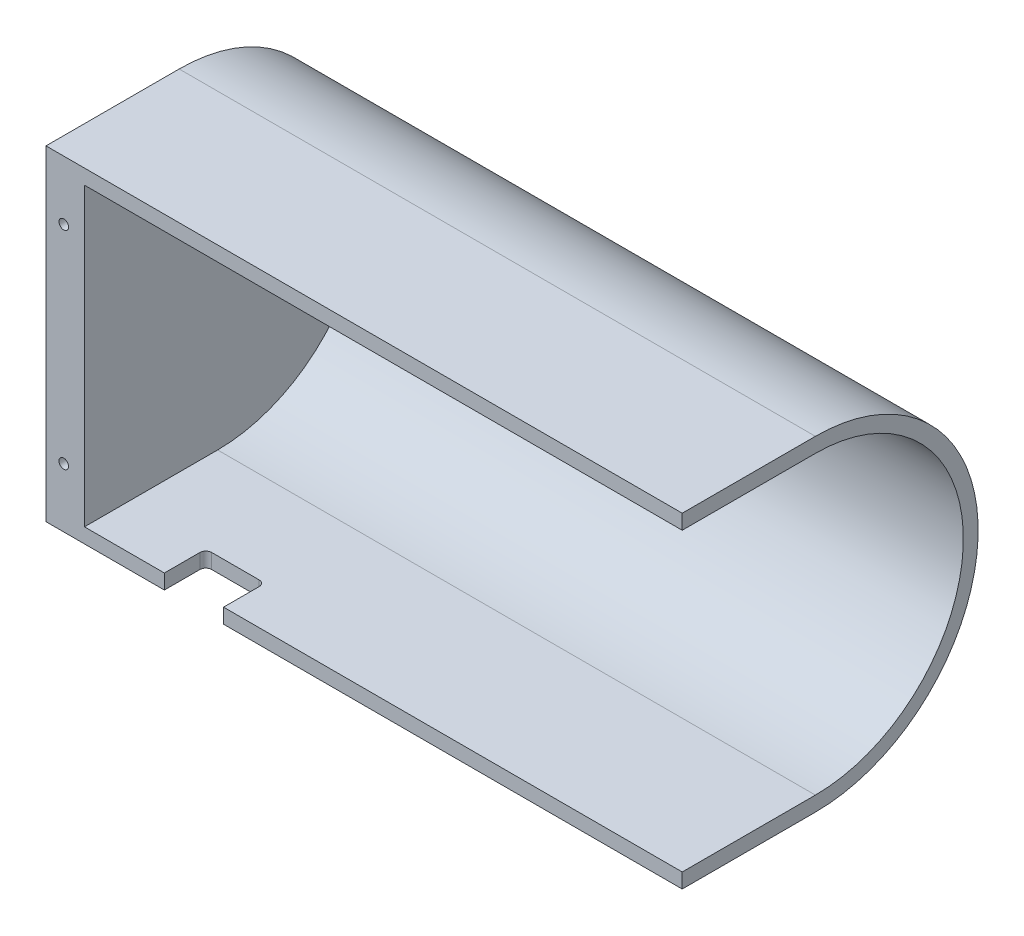
ISO-10303-21;
HEADER;
FILE_DESCRIPTION(('STEP AP214'),'2;1');
FILE_NAME('part.step','',(''),(''),'','','');
FILE_SCHEMA(('AUTOMOTIVE_DESIGN { 1 0 10303 214 1 1 1 1 }'));
ENDSEC;
DATA;
#1=APPLICATION_CONTEXT('core data for automotive mechanical design processes');
#2=APPLICATION_PROTOCOL_DEFINITION('international standard','automotive_design',2000,#1);
#3=PRODUCT_CONTEXT('',#1,'mechanical');
#4=PRODUCT('Part','Part','',(#3));
#5=PRODUCT_RELATED_PRODUCT_CATEGORY('part','',(#4));
#6=PRODUCT_DEFINITION_FORMATION('','',#4);
#7=PRODUCT_DEFINITION_CONTEXT('part definition',#1,'design');
#8=PRODUCT_DEFINITION('design','',#6,#7);
#9=PRODUCT_DEFINITION_SHAPE('','',#8);
#10=(LENGTH_UNIT() NAMED_UNIT(*) SI_UNIT(.MILLI.,.METRE.));
#11=(NAMED_UNIT(*) PLANE_ANGLE_UNIT() SI_UNIT($,.RADIAN.));
#12=(NAMED_UNIT(*) SI_UNIT($,.STERADIAN.) SOLID_ANGLE_UNIT());
#13=UNCERTAINTY_MEASURE_WITH_UNIT(LENGTH_MEASURE(1.E-05),#10,'distance_accuracy_value','');
#14=(GEOMETRIC_REPRESENTATION_CONTEXT(3) GLOBAL_UNCERTAINTY_ASSIGNED_CONTEXT((#13)) GLOBAL_UNIT_ASSIGNED_CONTEXT((#10,
#11,#12)) REPRESENTATION_CONTEXT('',''));
#15=CARTESIAN_POINT('',(0.,0.,0.));
#16=DIRECTION('',(0.,0.,1.));
#17=DIRECTION('',(1.,0.,0.));
#18=AXIS2_PLACEMENT_3D('',#15,#16,#17);
#19=CARTESIAN_POINT('',(0.,0.,-5.));
#20=DIRECTION('',(1.,0.,0.));
#21=DIRECTION('',(0.,1.,0.));
#22=AXIS2_PLACEMENT_3D('',#19,#20,#21);
#23=PLANE('',#22);
#24=DIRECTION('',(0.,0.,1.));
#25=VECTOR('',#24,1.);
#26=CARTESIAN_POINT('',(0.,55.,0.));
#27=LINE('',#26,#25);
#28=CARTESIAN_POINT('',(0.,55.,0.));
#29=VERTEX_POINT('',#28);
#30=CARTESIAN_POINT('',(0.,55.,45.));
#31=VERTEX_POINT('',#30);
#32=EDGE_CURVE('E11',#29,#31,#27,.T.);
#33=ORIENTED_EDGE('',*,*,#32,.F.);
#34=CARTESIAN_POINT('',(0.,0.,0.));
#35=DIRECTION('',(1.,0.,0.));
#36=DIRECTION('',(0.,-1.,0.));
#37=AXIS2_PLACEMENT_3D('',#34,#35,#36);
#38=CIRCLE('',#37,55.);
#39=CARTESIAN_POINT('',(0.,-55.,0.));
#40=VERTEX_POINT('',#39);
#41=EDGE_CURVE('E199',#40,#29,#38,.T.);
#42=ORIENTED_EDGE('',*,*,#41,.F.);
#43=DIRECTION('',(0.,0.,-1.));
#44=VECTOR('',#43,1.);
#45=CARTESIAN_POINT('',(0.,-55.,45.));
#46=LINE('',#45,#44);
#47=CARTESIAN_POINT('',(0.,-55.,45.));
#48=VERTEX_POINT('',#47);
#49=EDGE_CURVE('E234',#48,#40,#46,.T.);
#50=ORIENTED_EDGE('',*,*,#49,.F.);
#51=DIRECTION('',(0.,-1.,0.));
#52=VECTOR('',#51,1.);
#53=CARTESIAN_POINT('',(0.,55.,45.));
#54=LINE('',#53,#52);
#55=EDGE_CURVE('E27',#31,#48,#54,.T.);
#56=ORIENTED_EDGE('',*,*,#55,.F.);
#57=EDGE_LOOP('',(#33,#42,#50,#56));
#58=FACE_BOUND('',#57,.T.);
#59=ADVANCED_FACE('F16',(#58),#23,.F.);
#60=CARTESIAN_POINT('',(0.,55.,0.));
#61=DIRECTION('',(0.,1.,0.));
#62=DIRECTION('',(0.,0.,-1.));
#63=AXIS2_PLACEMENT_3D('',#60,#61,#62);
#64=PLANE('',#63);
#65=ORIENTED_EDGE('',*,*,#32,.T.);
#66=DIRECTION('',(1.,0.,0.));
#67=VECTOR('',#66,1.);
#68=CARTESIAN_POINT('',(0.,55.,45.));
#69=LINE('',#68,#67);
#70=CARTESIAN_POINT('',(215.,55.,45.));
#71=VERTEX_POINT('',#70);
#72=EDGE_CURVE('E231',#31,#71,#69,.T.);
#73=ORIENTED_EDGE('',*,*,#72,.T.);
#74=DIRECTION('',(0.,0.,1.));
#75=VECTOR('',#74,1.);
#76=CARTESIAN_POINT('',(215.,55.,0.));
#77=LINE('',#76,#75);
#78=CARTESIAN_POINT('',(215.,55.,0.));
#79=VERTEX_POINT('',#78);
#80=EDGE_CURVE('E200',#79,#71,#77,.T.);
#81=ORIENTED_EDGE('',*,*,#80,.F.);
#82=DIRECTION('',(1.,0.,0.));
#83=VECTOR('',#82,1.);
#84=CARTESIAN_POINT('',(0.,55.,0.));
#85=LINE('',#84,#83);
#86=EDGE_CURVE('E255',#29,#79,#85,.T.);
#87=ORIENTED_EDGE('',*,*,#86,.F.);
#88=EDGE_LOOP('',(#65,#73,#81,#87));
#89=FACE_BOUND('',#88,.T.);
#90=ADVANCED_FACE('F332',(#89),#64,.T.);
#91=CARTESIAN_POINT('',(0.,55.,45.));
#92=DIRECTION('',(0.,0.,1.));
#93=DIRECTION('',(1.,0.,0.));
#94=AXIS2_PLACEMENT_3D('',#91,#92,#93);
#95=PLANE('',#94);
#96=CARTESIAN_POINT('',(6.,-35.,45.));
#97=DIRECTION('',(0.,0.,-1.));
#98=DIRECTION('',(1.,0.,0.));
#99=AXIS2_PLACEMENT_3D('',#96,#97,#98);
#100=CIRCLE('',#99,1.621);
#101=CARTESIAN_POINT('',(4.379,-35.,45.));
#102=VERTEX_POINT('',#101);
#103=EDGE_CURVE('E286',#102,#102,#100,.T.);
#104=ORIENTED_EDGE('',*,*,#103,.T.);
#105=EDGE_LOOP('',(#104));
#106=FACE_BOUND('',#105,.T.);
#107=CARTESIAN_POINT('',(6.,35.,45.));
#108=DIRECTION('',(0.,0.,-1.));
#109=DIRECTION('',(1.,0.,0.));
#110=AXIS2_PLACEMENT_3D('',#107,#108,#109);
#111=CIRCLE('',#110,1.621);
#112=CARTESIAN_POINT('',(4.379,35.,45.));
#113=VERTEX_POINT('',#112);
#114=EDGE_CURVE('E264',#113,#113,#111,.T.);
#115=ORIENTED_EDGE('',*,*,#114,.T.);
#116=EDGE_LOOP('',(#115));
#117=FACE_BOUND('',#116,.T.);
#118=DIRECTION('',(0.,1.,0.));
#119=VECTOR('',#118,1.);
#120=CARTESIAN_POINT('',(40.,0.,45.));
#121=LINE('',#120,#119);
#122=CARTESIAN_POINT('',(40.,-55.,45.));
#123=VERTEX_POINT('',#122);
#124=CARTESIAN_POINT('',(40.,-50.,45.));
#125=VERTEX_POINT('',#124);
#126=EDGE_CURVE('E239',#123,#125,#121,.T.);
#127=ORIENTED_EDGE('',*,*,#126,.T.);
#128=DIRECTION('',(1.,0.,0.));
#129=VECTOR('',#128,1.);
#130=CARTESIAN_POINT('',(13.,-50.,45.));
#131=LINE('',#130,#129);
#132=CARTESIAN_POINT('',(13.,-50.,45.));
#133=VERTEX_POINT('',#132);
#134=EDGE_CURVE('E193',#133,#125,#131,.T.);
#135=ORIENTED_EDGE('',*,*,#134,.F.);
#136=DIRECTION('',(0.,-1.,0.));
#137=VECTOR('',#136,1.);
#138=CARTESIAN_POINT('',(13.,55.,45.));
#139=LINE('',#138,#137);
#140=CARTESIAN_POINT('',(13.,50.,45.));
#141=VERTEX_POINT('',#140);
#142=EDGE_CURVE('E187',#141,#133,#139,.T.);
#143=ORIENTED_EDGE('',*,*,#142,.F.);
#144=DIRECTION('',(1.,0.,0.));
#145=VECTOR('',#144,1.);
#146=CARTESIAN_POINT('',(13.,50.,45.));
#147=LINE('',#146,#145);
#148=CARTESIAN_POINT('',(215.,50.,45.));
#149=VERTEX_POINT('',#148);
#150=EDGE_CURVE('E192',#141,#149,#147,.T.);
#151=ORIENTED_EDGE('',*,*,#150,.T.);
#152=DIRECTION('',(0.,-1.,0.));
#153=VECTOR('',#152,1.);
#154=CARTESIAN_POINT('',(215.,55.,45.));
#155=LINE('',#154,#153);
#156=EDGE_CURVE('E207',#71,#149,#155,.T.);
#157=ORIENTED_EDGE('',*,*,#156,.F.);
#158=ORIENTED_EDGE('',*,*,#72,.F.);
#159=ORIENTED_EDGE('',*,*,#55,.T.);
#160=DIRECTION('',(1.,0.,0.));
#161=VECTOR('',#160,1.);
#162=CARTESIAN_POINT('',(0.,-55.,45.));
#163=LINE('',#162,#161);
#164=EDGE_CURVE('E270',#48,#123,#163,.T.);
#165=ORIENTED_EDGE('',*,*,#164,.T.);
#166=EDGE_LOOP('',(#127,#135,#143,#151,#157,#158,#159,#165));
#167=FACE_BOUND('',#166,.T.);
#168=ADVANCED_FACE('F190',(#106,#117,#167),#95,.T.);
#169=CARTESIAN_POINT('',(0.,-55.,45.));
#170=DIRECTION('',(0.,-1.,0.));
#171=DIRECTION('',(0.,0.,-1.));
#172=AXIS2_PLACEMENT_3D('',#169,#170,#171);
#173=PLANE('',#172);
#174=DIRECTION('',(0.,0.,1.));
#175=VECTOR('',#174,1.);
#176=CARTESIAN_POINT('',(40.,-55.,39.));
#177=LINE('',#176,#175);
#178=CARTESIAN_POINT('',(40.,-55.,33.));
#179=VERTEX_POINT('',#178);
#180=EDGE_CURVE('E243',#179,#123,#177,.T.);
#181=ORIENTED_EDGE('',*,*,#180,.T.);
#182=ORIENTED_EDGE('',*,*,#164,.F.);
#183=ORIENTED_EDGE('',*,*,#49,.T.);
#184=DIRECTION('',(1.,0.,0.));
#185=VECTOR('',#184,1.);
#186=CARTESIAN_POINT('',(0.,-55.,0.));
#187=LINE('',#186,#185);
#188=CARTESIAN_POINT('',(215.,-55.,0.));
#189=VERTEX_POINT('',#188);
#190=EDGE_CURVE('E273',#40,#189,#187,.T.);
#191=ORIENTED_EDGE('',*,*,#190,.T.);
#192=DIRECTION('',(0.,0.,-1.));
#193=VECTOR('',#192,1.);
#194=CARTESIAN_POINT('',(215.,-55.,45.));
#195=LINE('',#194,#193);
#196=CARTESIAN_POINT('',(215.,-55.,45.));
#197=VERTEX_POINT('',#196);
#198=EDGE_CURVE('E227',#197,#189,#195,.T.);
#199=ORIENTED_EDGE('',*,*,#198,.F.);
#200=DIRECTION('',(1.,0.,0.));
#201=VECTOR('',#200,1.);
#202=CARTESIAN_POINT('',(0.,-55.,45.));
#203=LINE('',#202,#201);
#204=CARTESIAN_POINT('',(60.,-55.,45.));
#205=VERTEX_POINT('',#204);
#206=EDGE_CURVE('E263',#205,#197,#203,.T.);
#207=ORIENTED_EDGE('',*,*,#206,.F.);
#208=DIRECTION('',(0.,0.,-1.));
#209=VECTOR('',#208,1.);
#210=CARTESIAN_POINT('',(60.,-55.,45.));
#211=LINE('',#210,#209);
#212=CARTESIAN_POINT('',(60.,-55.,33.));
#213=VERTEX_POINT('',#212);
#214=EDGE_CURVE('E225',#205,#213,#211,.T.);
#215=ORIENTED_EDGE('',*,*,#214,.T.);
#216=CARTESIAN_POINT('',(58.,-55.,33.));
#217=DIRECTION('',(0.,1.,0.));
#218=DIRECTION('',(0.,0.,-1.));
#219=AXIS2_PLACEMENT_3D('',#216,#217,#218);
#220=CIRCLE('',#219,2.);
#221=CARTESIAN_POINT('',(58.,-55.,31.));
#222=VERTEX_POINT('',#221);
#223=EDGE_CURVE('E163',#213,#222,#220,.T.);
#224=ORIENTED_EDGE('',*,*,#223,.T.);
#225=DIRECTION('',(-1.,0.,0.));
#226=VECTOR('',#225,1.);
#227=CARTESIAN_POINT('',(29.,-55.,31.));
#228=LINE('',#227,#226);
#229=CARTESIAN_POINT('',(42.,-55.,31.));
#230=VERTEX_POINT('',#229);
#231=EDGE_CURVE('E306',#222,#230,#228,.T.);
#232=ORIENTED_EDGE('',*,*,#231,.T.);
#233=CARTESIAN_POINT('',(42.,-55.,33.));
#234=DIRECTION('',(0.,1.,0.));
#235=DIRECTION('',(-1.,0.,0.));
#236=AXIS2_PLACEMENT_3D('',#233,#234,#235);
#237=CIRCLE('',#236,2.);
#238=EDGE_CURVE('E279',#230,#179,#237,.T.);
#239=ORIENTED_EDGE('',*,*,#238,.T.);
#240=EDGE_LOOP('',(#181,#182,#183,#191,#199,#207,#215,#224,#232,#239));
#241=FACE_BOUND('',#240,.T.);
#242=ADVANCED_FACE('F371',(#241),#173,.T.);
#243=CARTESIAN_POINT('',(0.,0.,0.));
#244=DIRECTION('',(1.,0.,0.));
#245=DIRECTION('',(0.,-1.,0.));
#246=AXIS2_PLACEMENT_3D('',#243,#244,#245);
#247=CYLINDRICAL_SURFACE('',#246,55.);
#248=ORIENTED_EDGE('',*,*,#41,.T.);
#249=ORIENTED_EDGE('',*,*,#86,.T.);
#250=CARTESIAN_POINT('',(215.,0.,0.));
#251=DIRECTION('',(1.,0.,0.));
#252=DIRECTION('',(0.,-1.,0.));
#253=AXIS2_PLACEMENT_3D('',#250,#251,#252);
#254=CIRCLE('',#253,55.);
#255=EDGE_CURVE('E230',#189,#79,#254,.T.);
#256=ORIENTED_EDGE('',*,*,#255,.F.);
#257=ORIENTED_EDGE('',*,*,#190,.F.);
#258=EDGE_LOOP('',(#248,#249,#256,#257));
#259=FACE_BOUND('',#258,.T.);
#260=ADVANCED_FACE('F386',(#259),#247,.T.);
#261=CARTESIAN_POINT('',(13.,0.,-5.));
#262=DIRECTION('',(1.,0.,0.));
#263=DIRECTION('',(0.,1.,0.));
#264=AXIS2_PLACEMENT_3D('',#261,#262,#263);
#265=PLANE('',#264);
#266=DIRECTION('',(0.,0.,-1.));
#267=VECTOR('',#266,1.);
#268=CARTESIAN_POINT('',(13.,-50.,-2.5));
#269=LINE('',#268,#267);
#270=CARTESIAN_POINT('',(13.,-50.,0.));
#271=VERTEX_POINT('',#270);
#272=EDGE_CURVE('E244',#133,#271,#269,.T.);
#273=ORIENTED_EDGE('',*,*,#272,.T.);
#274=CARTESIAN_POINT('',(13.,0.,0.));
#275=DIRECTION('',(1.,0.,0.));
#276=DIRECTION('',(0.,1.,0.));
#277=AXIS2_PLACEMENT_3D('',#274,#275,#276);
#278=CIRCLE('',#277,50.);
#279=CARTESIAN_POINT('',(13.,50.,0.));
#280=VERTEX_POINT('',#279);
#281=EDGE_CURVE('E211',#271,#280,#278,.T.);
#282=ORIENTED_EDGE('',*,*,#281,.T.);
#283=DIRECTION('',(0.,0.,1.));
#284=VECTOR('',#283,1.);
#285=CARTESIAN_POINT('',(13.,50.,20.));
#286=LINE('',#285,#284);
#287=EDGE_CURVE('E204',#280,#141,#286,.T.);
#288=ORIENTED_EDGE('',*,*,#287,.T.);
#289=ORIENTED_EDGE('',*,*,#142,.T.);
#290=EDGE_LOOP('',(#273,#282,#288,#289));
#291=FACE_BOUND('',#290,.T.);
#292=ADVANCED_FACE('F210',(#291),#265,.T.);
#293=CARTESIAN_POINT('',(215.,0.,-5.));
#294=DIRECTION('',(1.,0.,0.));
#295=DIRECTION('',(0.,1.,0.));
#296=AXIS2_PLACEMENT_3D('',#293,#294,#295);
#297=PLANE('',#296);
#298=ORIENTED_EDGE('',*,*,#156,.T.);
#299=DIRECTION('',(0.,0.,-1.));
#300=VECTOR('',#299,1.);
#301=CARTESIAN_POINT('',(215.,50.,45.));
#302=LINE('',#301,#300);
#303=CARTESIAN_POINT('',(215.,50.,0.));
#304=VERTEX_POINT('',#303);
#305=EDGE_CURVE('E179',#149,#304,#302,.T.);
#306=ORIENTED_EDGE('',*,*,#305,.T.);
#307=CARTESIAN_POINT('',(215.,0.,0.));
#308=DIRECTION('',(-1.,0.,0.));
#309=DIRECTION('',(0.,1.,0.));
#310=AXIS2_PLACEMENT_3D('',#307,#308,#309);
#311=CIRCLE('',#310,50.);
#312=CARTESIAN_POINT('',(215.,-50.,0.));
#313=VERTEX_POINT('',#312);
#314=EDGE_CURVE('E221',#304,#313,#311,.T.);
#315=ORIENTED_EDGE('',*,*,#314,.T.);
#316=DIRECTION('',(0.,0.,1.));
#317=VECTOR('',#316,1.);
#318=CARTESIAN_POINT('',(215.,-50.,0.));
#319=LINE('',#318,#317);
#320=CARTESIAN_POINT('',(215.,-50.,45.));
#321=VERTEX_POINT('',#320);
#322=EDGE_CURVE('E278',#313,#321,#319,.T.);
#323=ORIENTED_EDGE('',*,*,#322,.T.);
#324=DIRECTION('',(0.,-1.,0.));
#325=VECTOR('',#324,1.);
#326=CARTESIAN_POINT('',(215.,55.,45.));
#327=LINE('',#326,#325);
#328=EDGE_CURVE('E299',#321,#197,#327,.T.);
#329=ORIENTED_EDGE('',*,*,#328,.T.);
#330=ORIENTED_EDGE('',*,*,#198,.T.);
#331=ORIENTED_EDGE('',*,*,#255,.T.);
#332=ORIENTED_EDGE('',*,*,#80,.T.);
#333=EDGE_LOOP('',(#298,#306,#315,#323,#329,#330,#331,#332));
#334=FACE_BOUND('',#333,.T.);
#335=ADVANCED_FACE('F326',(#334),#297,.T.);
#336=CARTESIAN_POINT('',(13.,50.,45.));
#337=DIRECTION('',(0.,-1.,0.));
#338=DIRECTION('',(0.,0.,-1.));
#339=AXIS2_PLACEMENT_3D('',#336,#337,#338);
#340=PLANE('',#339);
#341=ORIENTED_EDGE('',*,*,#287,.F.);
#342=DIRECTION('',(1.,0.,0.));
#343=VECTOR('',#342,1.);
#344=CARTESIAN_POINT('',(13.,50.,0.));
#345=LINE('',#344,#343);
#346=EDGE_CURVE('E213',#280,#304,#345,.T.);
#347=ORIENTED_EDGE('',*,*,#346,.T.);
#348=ORIENTED_EDGE('',*,*,#305,.F.);
#349=ORIENTED_EDGE('',*,*,#150,.F.);
#350=EDGE_LOOP('',(#341,#347,#348,#349));
#351=FACE_BOUND('',#350,.T.);
#352=ADVANCED_FACE('F203',(#351),#340,.T.);
#353=CARTESIAN_POINT('',(13.,0.,0.));
#354=DIRECTION('',(1.,0.,0.));
#355=DIRECTION('',(0.,1.,0.));
#356=AXIS2_PLACEMENT_3D('',#353,#354,#355);
#357=CYLINDRICAL_SURFACE('',#356,50.);
#358=ORIENTED_EDGE('',*,*,#281,.F.);
#359=DIRECTION('',(1.,0.,0.));
#360=VECTOR('',#359,1.);
#361=CARTESIAN_POINT('',(13.,-50.,0.));
#362=LINE('',#361,#360);
#363=EDGE_CURVE('E20',#271,#313,#362,.T.);
#364=ORIENTED_EDGE('',*,*,#363,.T.);
#365=ORIENTED_EDGE('',*,*,#314,.F.);
#366=ORIENTED_EDGE('',*,*,#346,.F.);
#367=EDGE_LOOP('',(#358,#364,#365,#366));
#368=FACE_BOUND('',#367,.T.);
#369=ADVANCED_FACE('F413',(#368),#357,.F.);
#370=CARTESIAN_POINT('',(6.,-35.,40.));
#371=DIRECTION('',(0.,0.,1.));
#372=DIRECTION('',(1.,0.,0.));
#373=AXIS2_PLACEMENT_3D('',#370,#371,#372);
#374=CYLINDRICAL_SURFACE('',#373,1.621);
#375=ORIENTED_EDGE('',*,*,#103,.F.);
#376=DIRECTION('',(0.,0.,-1.));
#377=VECTOR('',#376,1.);
#378=CARTESIAN_POINT('',(4.379,-35.,40.));
#379=LINE('',#378,#377);
#380=CARTESIAN_POINT('',(4.379,-35.,35.));
#381=VERTEX_POINT('',#380);
#382=EDGE_CURVE('E283',#102,#381,#379,.T.);
#383=ORIENTED_EDGE('',*,*,#382,.T.);
#384=CARTESIAN_POINT('',(6.,-35.,35.));
#385=DIRECTION('',(0.,0.,1.));
#386=DIRECTION('',(1.,0.,0.));
#387=AXIS2_PLACEMENT_3D('',#384,#385,#386);
#388=CIRCLE('',#387,1.621);
#389=EDGE_CURVE('E294',#381,#381,#388,.T.);
#390=ORIENTED_EDGE('',*,*,#389,.F.);
#391=ORIENTED_EDGE('',*,*,#382,.F.);
#392=EDGE_LOOP('',(#375,#383,#390,#391));
#393=FACE_BOUND('',#392,.T.);
#394=ADVANCED_FACE('F397',(#393),#374,.F.);
#395=CARTESIAN_POINT('',(6.,-35.,34.5130024682782));
#396=DIRECTION('',(0.,0.,1.));
#397=DIRECTION('',(1.,0.,0.));
#398=AXIS2_PLACEMENT_3D('',#395,#396,#397);
#399=CONICAL_SURFACE('',#398,0.8105,1.02974425867665);
#400=ORIENTED_EDGE('',*,*,#389,.T.);
#401=DIRECTION('',(0.857167300702112,0.,-0.515038074910054));
#402=VECTOR('',#401,1.);
#403=CARTESIAN_POINT('',(5.1895,-35.,34.5130024682782));
#404=LINE('',#403,#402);
#405=CARTESIAN_POINT('',(6.,-35.,34.0260049365563));
#406=VERTEX_POINT('',#405);
#407=EDGE_CURVE('E298',#381,#406,#404,.T.);
#408=ORIENTED_EDGE('',*,*,#407,.T.);
#409=ORIENTED_EDGE('',*,*,#407,.F.);
#410=EDGE_LOOP('',(#400,#408,#409));
#411=FACE_BOUND('',#410,.T.);
#412=ADVANCED_FACE('F401',(#411),#399,.F.);
#413=CARTESIAN_POINT('',(6.,35.,40.));
#414=DIRECTION('',(0.,0.,1.));
#415=DIRECTION('',(1.,0.,0.));
#416=AXIS2_PLACEMENT_3D('',#413,#414,#415);
#417=CYLINDRICAL_SURFACE('',#416,1.621);
#418=ORIENTED_EDGE('',*,*,#114,.F.);
#419=DIRECTION('',(0.,0.,-1.));
#420=VECTOR('',#419,1.);
#421=CARTESIAN_POINT('',(4.379,35.,40.));
#422=LINE('',#421,#420);
#423=CARTESIAN_POINT('',(4.379,35.,35.));
#424=VERTEX_POINT('',#423);
#425=EDGE_CURVE('E268',#113,#424,#422,.T.);
#426=ORIENTED_EDGE('',*,*,#425,.T.);
#427=CARTESIAN_POINT('',(6.,35.,35.));
#428=DIRECTION('',(0.,0.,1.));
#429=DIRECTION('',(1.,0.,0.));
#430=AXIS2_PLACEMENT_3D('',#427,#428,#429);
#431=CIRCLE('',#430,1.621);
#432=EDGE_CURVE('E293',#424,#424,#431,.T.);
#433=ORIENTED_EDGE('',*,*,#432,.F.);
#434=ORIENTED_EDGE('',*,*,#425,.F.);
#435=EDGE_LOOP('',(#418,#426,#433,#434));
#436=FACE_BOUND('',#435,.T.);
#437=ADVANCED_FACE('F403',(#436),#417,.F.);
#438=CARTESIAN_POINT('',(6.,35.,34.5130024682782));
#439=DIRECTION('',(0.,0.,1.));
#440=DIRECTION('',(1.,0.,0.));
#441=AXIS2_PLACEMENT_3D('',#438,#439,#440);
#442=CONICAL_SURFACE('',#441,0.8105,1.02974425867665);
#443=ORIENTED_EDGE('',*,*,#432,.T.);
#444=DIRECTION('',(0.857167300702112,0.,-0.515038074910054));
#445=VECTOR('',#444,1.);
#446=CARTESIAN_POINT('',(5.1895,35.,34.5130024682782));
#447=LINE('',#446,#445);
#448=CARTESIAN_POINT('',(6.,35.,34.0260049365563));
#449=VERTEX_POINT('',#448);
#450=EDGE_CURVE('E269',#424,#449,#447,.T.);
#451=ORIENTED_EDGE('',*,*,#450,.T.);
#452=ORIENTED_EDGE('',*,*,#450,.F.);
#453=EDGE_LOOP('',(#443,#451,#452));
#454=FACE_BOUND('',#453,.T.);
#455=ADVANCED_FACE('F410',(#454),#442,.F.);
#456=CARTESIAN_POINT('',(0.,55.,45.));
#457=DIRECTION('',(0.,0.,1.));
#458=DIRECTION('',(1.,0.,0.));
#459=AXIS2_PLACEMENT_3D('',#456,#457,#458);
#460=PLANE('',#459);
#461=DIRECTION('',(0.,-1.,0.));
#462=VECTOR('',#461,1.);
#463=CARTESIAN_POINT('',(60.,0.,45.));
#464=LINE('',#463,#462);
#465=CARTESIAN_POINT('',(60.,-50.,45.));
#466=VERTEX_POINT('',#465);
#467=EDGE_CURVE('E240',#466,#205,#464,.T.);
#468=ORIENTED_EDGE('',*,*,#467,.T.);
#469=ORIENTED_EDGE('',*,*,#206,.T.);
#470=ORIENTED_EDGE('',*,*,#328,.F.);
#471=DIRECTION('',(1.,0.,0.));
#472=VECTOR('',#471,1.);
#473=CARTESIAN_POINT('',(13.,-50.,45.));
#474=LINE('',#473,#472);
#475=EDGE_CURVE('E274',#466,#321,#474,.T.);
#476=ORIENTED_EDGE('',*,*,#475,.F.);
#477=EDGE_LOOP('',(#468,#469,#470,#476));
#478=FACE_BOUND('',#477,.T.);
#479=ADVANCED_FACE('F436',(#478),#460,.T.);
#480=CARTESIAN_POINT('',(13.,-50.,0.));
#481=DIRECTION('',(0.,1.,0.));
#482=DIRECTION('',(0.,0.,-1.));
#483=AXIS2_PLACEMENT_3D('',#480,#481,#482);
#484=PLANE('',#483);
#485=DIRECTION('',(0.,0.,-1.));
#486=VECTOR('',#485,1.);
#487=CARTESIAN_POINT('',(40.,-50.,16.5));
#488=LINE('',#487,#486);
#489=CARTESIAN_POINT('',(40.,-50.,33.));
#490=VERTEX_POINT('',#489);
#491=EDGE_CURVE('E235',#125,#490,#488,.T.);
#492=ORIENTED_EDGE('',*,*,#491,.T.);
#493=CARTESIAN_POINT('',(42.,-50.,33.));
#494=DIRECTION('',(0.,-1.,0.));
#495=DIRECTION('',(-1.,0.,0.));
#496=AXIS2_PLACEMENT_3D('',#493,#494,#495);
#497=CIRCLE('',#496,2.);
#498=CARTESIAN_POINT('',(42.,-50.,31.));
#499=VERTEX_POINT('',#498);
#500=EDGE_CURVE('E282',#490,#499,#497,.T.);
#501=ORIENTED_EDGE('',*,*,#500,.T.);
#502=DIRECTION('',(1.,0.,0.));
#503=VECTOR('',#502,1.);
#504=CARTESIAN_POINT('',(35.5,-50.,31.));
#505=LINE('',#504,#503);
#506=CARTESIAN_POINT('',(58.,-50.,31.));
#507=VERTEX_POINT('',#506);
#508=EDGE_CURVE('E247',#499,#507,#505,.T.);
#509=ORIENTED_EDGE('',*,*,#508,.T.);
#510=CARTESIAN_POINT('',(58.,-50.,33.));
#511=DIRECTION('',(0.,-1.,0.));
#512=DIRECTION('',(0.,0.,-1.));
#513=AXIS2_PLACEMENT_3D('',#510,#511,#512);
#514=CIRCLE('',#513,2.);
#515=CARTESIAN_POINT('',(60.,-50.,33.));
#516=VERTEX_POINT('',#515);
#517=EDGE_CURVE('E355',#507,#516,#514,.T.);
#518=ORIENTED_EDGE('',*,*,#517,.T.);
#519=DIRECTION('',(0.,0.,1.));
#520=VECTOR('',#519,1.);
#521=CARTESIAN_POINT('',(60.,-50.,22.5));
#522=LINE('',#521,#520);
#523=EDGE_CURVE('E152',#516,#466,#522,.T.);
#524=ORIENTED_EDGE('',*,*,#523,.T.);
#525=ORIENTED_EDGE('',*,*,#475,.T.);
#526=ORIENTED_EDGE('',*,*,#322,.F.);
#527=ORIENTED_EDGE('',*,*,#363,.F.);
#528=ORIENTED_EDGE('',*,*,#272,.F.);
#529=ORIENTED_EDGE('',*,*,#134,.T.);
#530=EDGE_LOOP('',(#492,#501,#509,#518,#524,#525,#526,#527,#528,#529));
#531=FACE_BOUND('',#530,.T.);
#532=ADVANCED_FACE('F443',(#531),#484,.T.);
#533=CARTESIAN_POINT('',(42.,-55.,33.));
#534=DIRECTION('',(0.,1.,0.));
#535=DIRECTION('',(-1.,0.,0.));
#536=AXIS2_PLACEMENT_3D('',#533,#534,#535);
#537=CYLINDRICAL_SURFACE('',#536,2.);
#538=ORIENTED_EDGE('',*,*,#500,.F.);
#539=DIRECTION('',(0.,1.,0.));
#540=VECTOR('',#539,1.);
#541=CARTESIAN_POINT('',(40.,-55.,33.));
#542=LINE('',#541,#540);
#543=EDGE_CURVE('E313',#179,#490,#542,.T.);
#544=ORIENTED_EDGE('',*,*,#543,.F.);
#545=ORIENTED_EDGE('',*,*,#238,.F.);
#546=DIRECTION('',(0.,1.,0.));
#547=VECTOR('',#546,1.);
#548=CARTESIAN_POINT('',(42.,-55.,31.));
#549=LINE('',#548,#547);
#550=EDGE_CURVE('E250',#230,#499,#549,.T.);
#551=ORIENTED_EDGE('',*,*,#550,.T.);
#552=EDGE_LOOP('',(#538,#544,#545,#551));
#553=FACE_BOUND('',#552,.T.);
#554=ADVANCED_FACE('F18',(#553),#537,.F.);
#555=CARTESIAN_POINT('',(40.,-55.,33.));
#556=DIRECTION('',(-1.,0.,0.));
#557=DIRECTION('',(0.,0.,1.));
#558=AXIS2_PLACEMENT_3D('',#555,#556,#557);
#559=PLANE('',#558);
#560=ORIENTED_EDGE('',*,*,#491,.F.);
#561=ORIENTED_EDGE('',*,*,#126,.F.);
#562=ORIENTED_EDGE('',*,*,#180,.F.);
#563=ORIENTED_EDGE('',*,*,#543,.T.);
#564=EDGE_LOOP('',(#560,#561,#562,#563));
#565=FACE_BOUND('',#564,.T.);
#566=ADVANCED_FACE('F381',(#565),#559,.F.);
#567=CARTESIAN_POINT('',(60.,-55.,45.));
#568=DIRECTION('',(1.,0.,0.));
#569=DIRECTION('',(0.,0.,1.));
#570=AXIS2_PLACEMENT_3D('',#567,#568,#569);
#571=PLANE('',#570);
#572=ORIENTED_EDGE('',*,*,#523,.F.);
#573=DIRECTION('',(0.,1.,0.));
#574=VECTOR('',#573,1.);
#575=CARTESIAN_POINT('',(60.,-55.,33.));
#576=LINE('',#575,#574);
#577=EDGE_CURVE('E260',#213,#516,#576,.T.);
#578=ORIENTED_EDGE('',*,*,#577,.F.);
#579=ORIENTED_EDGE('',*,*,#214,.F.);
#580=ORIENTED_EDGE('',*,*,#467,.F.);
#581=EDGE_LOOP('',(#572,#578,#579,#580));
#582=FACE_BOUND('',#581,.T.);
#583=ADVANCED_FACE('F457',(#582),#571,.F.);
#584=CARTESIAN_POINT('',(58.,-55.,33.));
#585=DIRECTION('',(0.,1.,0.));
#586=DIRECTION('',(0.,0.,-1.));
#587=AXIS2_PLACEMENT_3D('',#584,#585,#586);
#588=CYLINDRICAL_SURFACE('',#587,2.);
#589=ORIENTED_EDGE('',*,*,#517,.F.);
#590=DIRECTION('',(0.,1.,0.));
#591=VECTOR('',#590,1.);
#592=CARTESIAN_POINT('',(58.,-55.,31.));
#593=LINE('',#592,#591);
#594=EDGE_CURVE('E359',#222,#507,#593,.T.);
#595=ORIENTED_EDGE('',*,*,#594,.F.);
#596=ORIENTED_EDGE('',*,*,#223,.F.);
#597=ORIENTED_EDGE('',*,*,#577,.T.);
#598=EDGE_LOOP('',(#589,#595,#596,#597));
#599=FACE_BOUND('',#598,.T.);
#600=ADVANCED_FACE('F464',(#599),#588,.F.);
#601=CARTESIAN_POINT('',(58.,-55.,31.));
#602=DIRECTION('',(0.,0.,-1.));
#603=DIRECTION('',(0.,-1.,0.));
#604=AXIS2_PLACEMENT_3D('',#601,#602,#603);
#605=PLANE('',#604);
#606=ORIENTED_EDGE('',*,*,#508,.F.);
#607=ORIENTED_EDGE('',*,*,#550,.F.);
#608=ORIENTED_EDGE('',*,*,#231,.F.);
#609=ORIENTED_EDGE('',*,*,#594,.T.);
#610=EDGE_LOOP('',(#606,#607,#608,#609));
#611=FACE_BOUND('',#610,.T.);
#612=ADVANCED_FACE('F375',(#611),#605,.F.);
#613=CLOSED_SHELL('',(#59,#90,#168,#242,#260,#292,#335,#352,#369,#394,#412,#437,#455,#479,#532,
#554,#566,#583,#600,#612));
#614=MANIFOLD_SOLID_BREP('B1',#613);
#615=ADVANCED_BREP_SHAPE_REPRESENTATION('',(#18,#614),#14);
#616=SHAPE_DEFINITION_REPRESENTATION(#9,#615);
ENDSEC;
END-ISO-10303-21;
